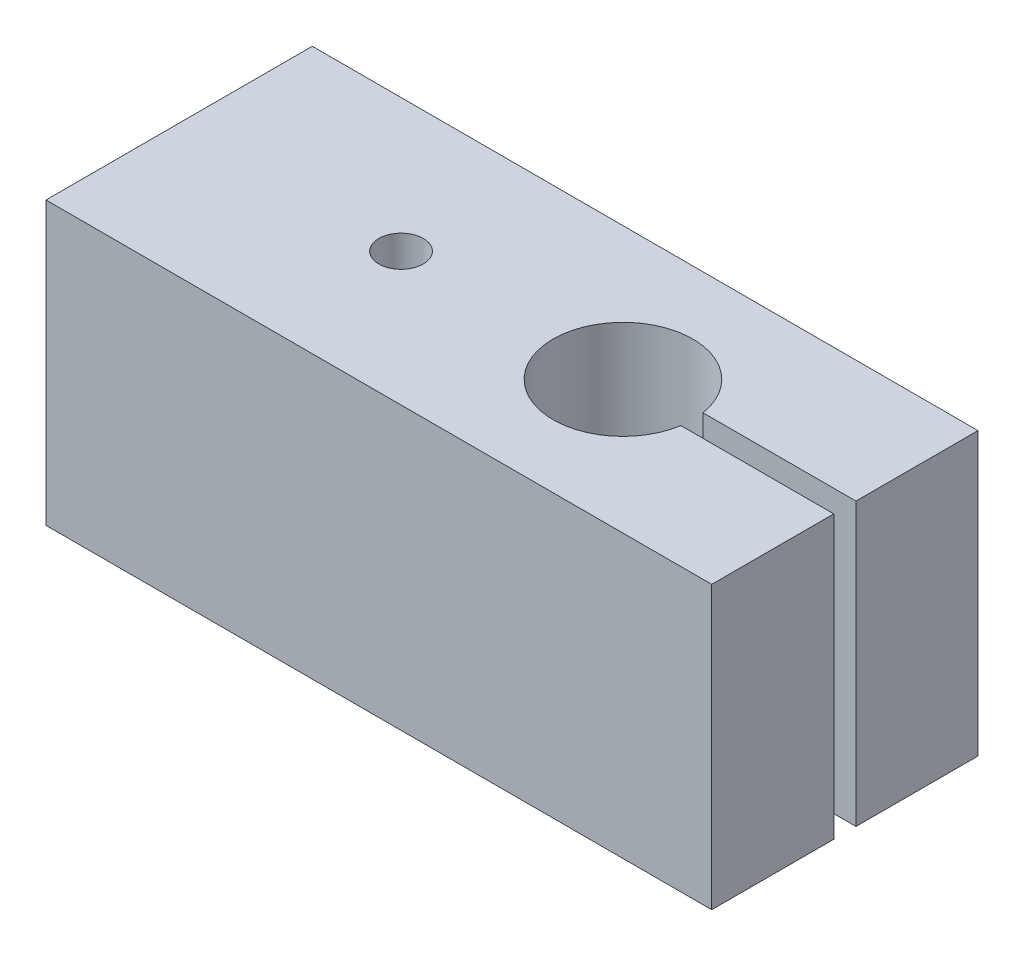
ISO-10303-21;
HEADER;
FILE_DESCRIPTION(('STEP AP214'),'2;1');
FILE_NAME('part.step','',(''),(''),'','','');
FILE_SCHEMA(('AUTOMOTIVE_DESIGN { 1 0 10303 214 1 1 1 1 }'));
ENDSEC;
DATA;
#1=APPLICATION_CONTEXT('core data for automotive mechanical design processes');
#2=APPLICATION_PROTOCOL_DEFINITION('international standard','automotive_design',2000,#1);
#3=PRODUCT_CONTEXT('',#1,'mechanical');
#4=PRODUCT('Part','Part','',(#3));
#5=PRODUCT_RELATED_PRODUCT_CATEGORY('part','',(#4));
#6=PRODUCT_DEFINITION_FORMATION('','',#4);
#7=PRODUCT_DEFINITION_CONTEXT('part definition',#1,'design');
#8=PRODUCT_DEFINITION('design','',#6,#7);
#9=PRODUCT_DEFINITION_SHAPE('','',#8);
#10=(LENGTH_UNIT() NAMED_UNIT(*) SI_UNIT(.MILLI.,.METRE.));
#11=(NAMED_UNIT(*) PLANE_ANGLE_UNIT() SI_UNIT($,.RADIAN.));
#12=(NAMED_UNIT(*) SI_UNIT($,.STERADIAN.) SOLID_ANGLE_UNIT());
#13=UNCERTAINTY_MEASURE_WITH_UNIT(LENGTH_MEASURE(1.E-05),#10,'distance_accuracy_value','');
#14=(GEOMETRIC_REPRESENTATION_CONTEXT(3) GLOBAL_UNCERTAINTY_ASSIGNED_CONTEXT((#13)) GLOBAL_UNIT_ASSIGNED_CONTEXT((#10,
#11,#12)) REPRESENTATION_CONTEXT('',''));
#15=CARTESIAN_POINT('',(0.,0.,0.));
#16=DIRECTION('',(0.,0.,1.));
#17=DIRECTION('',(1.,0.,0.));
#18=AXIS2_PLACEMENT_3D('',#15,#16,#17);
#19=CARTESIAN_POINT('',(10.,12.7,6.));
#20=DIRECTION('',(-1.,0.,0.));
#21=DIRECTION('',(0.,0.,1.));
#22=AXIS2_PLACEMENT_3D('',#19,#20,#21);
#23=PLANE('',#22);
#24=DIRECTION('',(0.,0.,-1.));
#25=VECTOR('',#24,1.);
#26=CARTESIAN_POINT('',(10.,0.,6.));
#27=LINE('',#26,#25);
#28=CARTESIAN_POINT('',(10.,0.,6.));
#29=VERTEX_POINT('',#28);
#30=CARTESIAN_POINT('',(10.,0.,0.5));
#31=VERTEX_POINT('',#30);
#32=EDGE_CURVE('E135',#29,#31,#27,.T.);
#33=ORIENTED_EDGE('',*,*,#32,.T.);
#34=DIRECTION('',(0.,1.,0.));
#35=VECTOR('',#34,1.);
#36=CARTESIAN_POINT('',(10.,0.,0.5));
#37=LINE('',#36,#35);
#38=CARTESIAN_POINT('',(10.,12.7,0.5));
#39=VERTEX_POINT('',#38);
#40=EDGE_CURVE('E224',#31,#39,#37,.T.);
#41=ORIENTED_EDGE('',*,*,#40,.T.);
#42=DIRECTION('',(0.,0.,-1.));
#43=VECTOR('',#42,1.);
#44=CARTESIAN_POINT('',(10.,12.7,6.));
#45=LINE('',#44,#43);
#46=CARTESIAN_POINT('',(10.,12.7,6.));
#47=VERTEX_POINT('',#46);
#48=EDGE_CURVE('E222',#47,#39,#45,.T.);
#49=ORIENTED_EDGE('',*,*,#48,.F.);
#50=DIRECTION('',(0.,-1.,0.));
#51=VECTOR('',#50,1.);
#52=CARTESIAN_POINT('',(10.,12.7,6.));
#53=LINE('',#52,#51);
#54=EDGE_CURVE('E157',#47,#29,#53,.T.);
#55=ORIENTED_EDGE('',*,*,#54,.T.);
#56=EDGE_LOOP('',(#33,#41,#49,#55));
#57=FACE_BOUND('',#56,.T.);
#58=ADVANCED_FACE('F36',(#57),#23,.F.);
#59=CARTESIAN_POINT('',(-10.,12.7,0.));
#60=DIRECTION('',(0.,-1.,0.));
#61=DIRECTION('',(0.,0.,-1.));
#62=AXIS2_PLACEMENT_3D('',#59,#60,#61);
#63=CYLINDRICAL_SURFACE('',#62,1.);
#64=CARTESIAN_POINT('',(-10.,12.7,0.));
#65=DIRECTION('',(0.,1.,0.));
#66=DIRECTION('',(0.,0.,1.));
#67=AXIS2_PLACEMENT_3D('',#64,#65,#66);
#68=CIRCLE('',#67,1.);
#69=CARTESIAN_POINT('',(-10.,12.7,1.));
#70=VERTEX_POINT('',#69);
#71=EDGE_CURVE('E340',#70,#70,#68,.T.);
#72=ORIENTED_EDGE('',*,*,#71,.T.);
#73=EDGE_LOOP('',(#72));
#74=FACE_BOUND('',#73,.T.);
#75=CARTESIAN_POINT('',(-10.,0.,0.));
#76=DIRECTION('',(0.,1.,0.));
#77=DIRECTION('',(0.,0.,1.));
#78=AXIS2_PLACEMENT_3D('',#75,#76,#77);
#79=CIRCLE('',#78,1.);
#80=CARTESIAN_POINT('',(-10.,0.,1.));
#81=VERTEX_POINT('',#80);
#82=EDGE_CURVE('E328',#81,#81,#79,.T.);
#83=ORIENTED_EDGE('',*,*,#82,.F.);
#84=EDGE_LOOP('',(#83));
#85=FACE_BOUND('',#84,.T.);
#86=CARTESIAN_POINT('',(-10.,10.2229833462074,-0.999999999999998));
#87=CARTESIAN_POINT('',(-10.0276629851065,10.2229814858018,-1.00000033749611));
#88=CARTESIAN_POINT('',(-10.0553122630182,10.2232800994947,-0.998851407375364));
#89=CARTESIAN_POINT('',(-10.1104040353036,10.2244590477456,-0.994271295395751));
#90=CARTESIAN_POINT('',(-10.1378465636871,10.2253392844169,-0.990840497572676));
#91=CARTESIAN_POINT('',(-10.2194531732088,10.2288171097205,-0.977175239382523));
#92=CARTESIAN_POINT('',(-10.2730564684822,10.2322520314881,-0.963567695172489));
#93=CARTESIAN_POINT('',(-10.377124673782,10.24095422588,-0.927798076247993));
#94=CARTESIAN_POINT('',(-10.4275898782129,10.2462213263093,-0.905636805423832));
#95=CARTESIAN_POINT('',(-10.5241114486473,10.2579913447194,-0.853415378025861));
#96=CARTESIAN_POINT('',(-10.570166627891,10.2644945939565,-0.823353103356928));
#97=CARTESIAN_POINT('',(-10.6575438819061,10.2781626239803,-0.755484471828065));
#98=CARTESIAN_POINT('',(-10.6987548862455,10.2853379102892,-0.717537268783972));
#99=CARTESIAN_POINT('',(-10.7743020894827,10.2994510439619,-0.635275780516226));
#100=CARTESIAN_POINT('',(-10.8086371894679,10.3063888532254,-0.590960479478827));
#101=CARTESIAN_POINT('',(-10.8699110016186,10.3193618228325,-0.496456899401685));
#102=CARTESIAN_POINT('',(-10.896739895984,10.3253830468173,-0.446195340334468));
#103=CARTESIAN_POINT('',(-10.9415247341967,10.3357234625059,-0.341702590842913));
#104=CARTESIAN_POINT('',(-10.9594824242998,10.340042989147,-0.287472184083004));
#105=CARTESIAN_POINT('',(-10.9856589927774,10.3464190000513,-0.177744108525154));
#106=CARTESIAN_POINT('',(-10.9940676724228,10.348519529013,-0.122294322002852));
#107=CARTESIAN_POINT('',(-11.0015033715433,10.3503743815082,-0.0107327756816735));
#108=CARTESIAN_POINT('',(-11.0005315701923,10.3501289999344,0.0453789000287115));
#109=CARTESIAN_POINT('',(-10.9893700363145,10.3473523736574,0.155352492972102));
#110=CARTESIAN_POINT('',(-10.9793853834005,10.3448719867736,0.209236701739861));
#111=CARTESIAN_POINT('',(-10.9508113208172,10.337963306365,0.314538711084346));
#112=CARTESIAN_POINT('',(-10.9322215304314,10.3335349266556,0.365956402423993));
#113=CARTESIAN_POINT('',(-10.8867987193293,10.323149977618,0.465407286024544));
#114=CARTESIAN_POINT('',(-10.8598926057672,10.3171799382756,0.513405629602253));
#115=CARTESIAN_POINT('',(-10.7986568701665,10.3043594554192,0.604276631230019));
#116=CARTESIAN_POINT('',(-10.7643261297468,10.297508879332,0.647148515562294));
#117=CARTESIAN_POINT('',(-10.6881210879187,10.2834556602287,0.727769389708495));
#118=CARTESIAN_POINT('',(-10.6460683634602,10.2762485047769,0.765349103054131));
#119=CARTESIAN_POINT('',(-10.5561701330723,10.2624616828401,0.832969575186241));
#120=CARTESIAN_POINT('',(-10.5083230467164,10.2558821884299,0.863008270245065));
#121=CARTESIAN_POINT('',(-10.4078544021762,10.2440781358633,0.914804709285964));
#122=CARTESIAN_POINT('',(-10.3552085351039,10.2388610600914,0.936517017887272));
#123=CARTESIAN_POINT('',(-10.2468830715817,10.2304705880706,0.970702351849831));
#124=CARTESIAN_POINT('',(-10.1912081448502,10.2272941376144,0.983189189212133));
#125=CARTESIAN_POINT('',(-10.1125426192411,10.2245529068152,0.993904635150939));
#126=CARTESIAN_POINT('',(-10.0900802967868,10.2239652311086,0.996190790966709));
#127=CARTESIAN_POINT('',(-10.0450822100907,10.2231806248897,0.999236757697394));
#128=CARTESIAN_POINT('',(-10.0225466240447,10.2229830621946,0.999999038096046));
#129=CARTESIAN_POINT('',(-10.,10.2229833462074,1.));
#130=B_SPLINE_CURVE_WITH_KNOTS('',3,(#86,#87,#88,#89,#90,#91,#92,#93,#94,#95,#96,#97,#98,#99,
#100,#101,#102,#103,#104,#105,#106,#107,#108,#109,#110,#111,#112,#113,#114,#115,#116,#117,#118,
#119,#120,#121,#122,#123,#124,#125,#126,#127,#128,#129),.UNSPECIFIED.,.F.,.F.,(4,2,2,2,2,2,2,2,
2,2,2,2,2,2,2,2,2,2,2,2,2,4),(0.,0.082936530339771,0.165859106084651,0.331229963080316,
0.496585282091498,0.661984974726747,0.830641897427971,0.99932575353919,1.17036187098235,
1.34136430732424,1.50890481515325,1.67642426256639,1.84022545479275,2.00403389475838,
2.16932509450376,2.33464120964329,2.50441429534542,2.67423379180967,2.84496720161067,
3.01544447539985,3.08315848722647,3.1507626773167),.UNSPECIFIED.);
#131=CARTESIAN_POINT('',(-10.,10.2229833462074,-0.999999999999998));
#132=VERTEX_POINT('',#131);
#133=CARTESIAN_POINT('',(-10.,10.2229833462074,1.));
#134=VERTEX_POINT('',#133);
#135=EDGE_CURVE('E163',#132,#134,#130,.T.);
#136=ORIENTED_EDGE('',*,*,#135,.F.);
#137=DIRECTION('',(0.,-1.,0.));
#138=VECTOR('',#137,1.);
#139=CARTESIAN_POINT('',(-10.,12.7,-0.999999999999998));
#140=LINE('',#139,#138);
#141=CARTESIAN_POINT('',(-10.,2.47701665379259,-0.999999999999998));
#142=VERTEX_POINT('',#141);
#143=EDGE_CURVE('E11',#132,#142,#140,.T.);
#144=ORIENTED_EDGE('',*,*,#143,.T.);
#145=CARTESIAN_POINT('',(-10.,2.47701665379258,1.));
#146=CARTESIAN_POINT('',(-10.0276629851065,2.47701851419822,1.00000033749611));
#147=CARTESIAN_POINT('',(-10.0553122630182,2.47671990050529,0.998851407375367));
#148=CARTESIAN_POINT('',(-10.1104040353036,2.47554095225441,0.994271295395755));
#149=CARTESIAN_POINT('',(-10.1378465636871,2.47466071558313,0.990840497572679));
#150=CARTESIAN_POINT('',(-10.2194531732088,2.47118289027946,0.977175239382526));
#151=CARTESIAN_POINT('',(-10.2730564684822,2.46774796851191,0.963567695172493));
#152=CARTESIAN_POINT('',(-10.377124673782,2.45904577411997,0.927798076247996));
#153=CARTESIAN_POINT('',(-10.4275898782129,2.4537786736907,0.905636805423835));
#154=CARTESIAN_POINT('',(-10.5241114486473,2.4420086552806,0.853415378025865));
#155=CARTESIAN_POINT('',(-10.570166627891,2.43550540604353,0.823353103356932));
#156=CARTESIAN_POINT('',(-10.6575438819061,2.42183737601974,0.755484471828067));
#157=CARTESIAN_POINT('',(-10.6987548862455,2.41466208971084,0.717537268783974));
#158=CARTESIAN_POINT('',(-10.7743020894827,2.40054895603806,0.635275780516227));
#159=CARTESIAN_POINT('',(-10.8086371894679,2.39361114677463,0.590960479478828));
#160=CARTESIAN_POINT('',(-10.8699110016186,2.38063817716751,0.496456899401687));
#161=CARTESIAN_POINT('',(-10.896739895984,2.37461695318269,0.44619534033447));
#162=CARTESIAN_POINT('',(-10.9415247341967,2.36427653749411,0.341702590842916));
#163=CARTESIAN_POINT('',(-10.9594824242998,2.35995701085299,0.287472184083006));
#164=CARTESIAN_POINT('',(-10.9856589927774,2.35358099994872,0.177744108525157));
#165=CARTESIAN_POINT('',(-10.9940676724228,2.35148047098699,0.122294322002855));
#166=CARTESIAN_POINT('',(-11.0015033715433,2.34962561849184,0.0107327756816766));
#167=CARTESIAN_POINT('',(-11.0005315701923,2.34987100006555,-0.0453789000287084));
#168=CARTESIAN_POINT('',(-10.9893700363145,2.35264762634264,-0.155352492972099));
#169=CARTESIAN_POINT('',(-10.9793853834005,2.35512801322639,-0.209236701739857));
#170=CARTESIAN_POINT('',(-10.9508113208172,2.36203669363504,-0.314538711084342));
#171=CARTESIAN_POINT('',(-10.9322215304314,2.36646507334444,-0.36595640242399));
#172=CARTESIAN_POINT('',(-10.8867987193293,2.37685002238202,-0.465407286024541));
#173=CARTESIAN_POINT('',(-10.8598926057672,2.38282006172445,-0.51340562960225));
#174=CARTESIAN_POINT('',(-10.7986568701665,2.39564054458081,-0.604276631230016));
#175=CARTESIAN_POINT('',(-10.7643261297468,2.40249112066802,-0.64714851556229));
#176=CARTESIAN_POINT('',(-10.6881210879187,2.41654433977135,-0.727769389708492));
#177=CARTESIAN_POINT('',(-10.6460683634602,2.42375149522315,-0.765349103054128));
#178=CARTESIAN_POINT('',(-10.5561701330723,2.43753831715994,-0.832969575186238));
#179=CARTESIAN_POINT('',(-10.5083230467164,2.44411781157007,-0.863008270245062));
#180=CARTESIAN_POINT('',(-10.4078544021762,2.45592186413675,-0.914804709285961));
#181=CARTESIAN_POINT('',(-10.3552085351039,2.46113893990864,-0.936517017887268));
#182=CARTESIAN_POINT('',(-10.2468830715817,2.46952941192945,-0.970702351849827));
#183=CARTESIAN_POINT('',(-10.1912081448502,2.47270586238565,-0.98318918921213));
#184=CARTESIAN_POINT('',(-10.1125426192411,2.47544709318476,-0.993904635150935));
#185=CARTESIAN_POINT('',(-10.0900802967868,2.47603476889141,-0.996190790966706));
#186=CARTESIAN_POINT('',(-10.0450822100907,2.47681937511026,-0.999236757697391));
#187=CARTESIAN_POINT('',(-10.0225466240447,2.47701693780539,-0.999999038096043));
#188=CARTESIAN_POINT('',(-10.,2.47701665379259,-0.999999999999998));
#189=B_SPLINE_CURVE_WITH_KNOTS('',3,(#145,#146,#147,#148,#149,#150,#151,#152,#153,#154,#155,
#156,#157,#158,#159,#160,#161,#162,#163,#164,#165,#166,#167,#168,#169,#170,#171,#172,#173,#174,
#175,#176,#177,#178,#179,#180,#181,#182,#183,#184,#185,#186,#187,#188),.UNSPECIFIED.,.F.,.F.,(4,
2,2,2,2,2,2,2,2,2,2,2,2,2,2,2,2,2,2,2,2,4),(0.,0.082936530339771,0.165859106084653,
0.331229963080316,0.496585282091498,0.661984974726747,0.830641897427974,0.999325753539193,
1.17036187098235,1.34136430732424,1.50890481515325,1.67642426256639,1.84022545479275,
2.00403389475838,2.16932509450376,2.33464120964329,2.50441429534542,2.67423379180967,
2.84496720161067,3.01544447539985,3.08315848722647,3.1507626773167),.UNSPECIFIED.);
#190=CARTESIAN_POINT('',(-10.,2.47701665379258,1.));
#191=VERTEX_POINT('',#190);
#192=EDGE_CURVE('E44',#191,#142,#189,.T.);
#193=ORIENTED_EDGE('',*,*,#192,.F.);
#194=DIRECTION('',(0.,-1.,0.));
#195=VECTOR('',#194,1.);
#196=CARTESIAN_POINT('',(-10.,12.7,1.));
#197=LINE('',#196,#195);
#198=EDGE_CURVE('E160',#191,#134,#197,.F.);
#199=ORIENTED_EDGE('',*,*,#198,.T.);
#200=EDGE_LOOP('',(#136,#144,#193,#199));
#201=FACE_BOUND('',#200,.T.);
#202=ADVANCED_FACE('F175',(#74,#85,#201),#63,.F.);
#203=CARTESIAN_POINT('',(0.,12.7,0.));
#204=DIRECTION('',(0.,1.,0.));
#205=DIRECTION('',(0.,0.,1.));
#206=AXIS2_PLACEMENT_3D('',#203,#204,#205);
#207=PLANE('',#206);
#208=DIRECTION('',(1.,0.,0.));
#209=VECTOR('',#208,1.);
#210=CARTESIAN_POINT('',(10.,12.7,0.5));
#211=LINE('',#210,#209);
#212=CARTESIAN_POINT('',(3.1100643080168,12.7,0.500000000000001));
#213=VERTEX_POINT('',#212);
#214=EDGE_CURVE('E120',#213,#39,#211,.T.);
#215=ORIENTED_EDGE('',*,*,#214,.F.);
#216=CARTESIAN_POINT('',(0.,12.7,0.));
#217=DIRECTION('',(0.,1.,0.));
#218=DIRECTION('',(0.,0.,1.));
#219=AXIS2_PLACEMENT_3D('',#216,#217,#218);
#220=CIRCLE('',#219,3.15);
#221=CARTESIAN_POINT('',(3.1100643080168,12.7,-0.500000000000003));
#222=VERTEX_POINT('',#221);
#223=EDGE_CURVE('E140',#222,#213,#220,.T.);
#224=ORIENTED_EDGE('',*,*,#223,.F.);
#225=DIRECTION('',(-1.,0.,0.));
#226=VECTOR('',#225,1.);
#227=CARTESIAN_POINT('',(10.,12.7,-0.5));
#228=LINE('',#227,#226);
#229=CARTESIAN_POINT('',(10.,12.7,-0.5));
#230=VERTEX_POINT('',#229);
#231=EDGE_CURVE('E59',#230,#222,#228,.T.);
#232=ORIENTED_EDGE('',*,*,#231,.F.);
#233=CARTESIAN_POINT('',(10.,12.7,-6.00000000000001));
#234=VERTEX_POINT('',#233);
#235=EDGE_CURVE('E128',#230,#234,#45,.T.);
#236=ORIENTED_EDGE('',*,*,#235,.T.);
#237=DIRECTION('',(-1.,0.,0.));
#238=VECTOR('',#237,1.);
#239=CARTESIAN_POINT('',(10.,12.7,-6.00000000000001));
#240=LINE('',#239,#238);
#241=CARTESIAN_POINT('',(-20.,12.7,-6.));
#242=VERTEX_POINT('',#241);
#243=EDGE_CURVE('E227',#234,#242,#240,.T.);
#244=ORIENTED_EDGE('',*,*,#243,.T.);
#245=DIRECTION('',(0.,0.,1.));
#246=VECTOR('',#245,1.);
#247=CARTESIAN_POINT('',(-20.,12.7,-6.));
#248=LINE('',#247,#246);
#249=CARTESIAN_POINT('',(-20.,12.7,6.));
#250=VERTEX_POINT('',#249);
#251=EDGE_CURVE('E152',#242,#250,#248,.T.);
#252=ORIENTED_EDGE('',*,*,#251,.T.);
#253=DIRECTION('',(1.,0.,0.));
#254=VECTOR('',#253,1.);
#255=CARTESIAN_POINT('',(-20.,12.7,6.));
#256=LINE('',#255,#254);
#257=EDGE_CURVE('E147',#250,#47,#256,.T.);
#258=ORIENTED_EDGE('',*,*,#257,.T.);
#259=ORIENTED_EDGE('',*,*,#48,.T.);
#260=EDGE_LOOP('',(#215,#224,#232,#236,#244,#252,#258,#259));
#261=FACE_BOUND('',#260,.T.);
#262=ORIENTED_EDGE('',*,*,#71,.F.);
#263=EDGE_LOOP('',(#262));
#264=FACE_BOUND('',#263,.T.);
#265=ADVANCED_FACE('F200',(#261,#264),#207,.T.);
#266=CARTESIAN_POINT('',(0.,0.,0.));
#267=DIRECTION('',(0.,1.,0.));
#268=DIRECTION('',(0.,0.,1.));
#269=AXIS2_PLACEMENT_3D('',#266,#267,#268);
#270=PLANE('',#269);
#271=CARTESIAN_POINT('',(0.,0.,0.));
#272=DIRECTION('',(0.,1.,0.));
#273=DIRECTION('',(0.,0.,1.));
#274=AXIS2_PLACEMENT_3D('',#271,#272,#273);
#275=CIRCLE('',#274,3.15);
#276=CARTESIAN_POINT('',(3.1100643080168,0.,-0.500000000000001));
#277=VERTEX_POINT('',#276);
#278=CARTESIAN_POINT('',(3.1100643080168,0.,0.500000000000001));
#279=VERTEX_POINT('',#278);
#280=EDGE_CURVE('E233',#277,#279,#275,.T.);
#281=ORIENTED_EDGE('',*,*,#280,.T.);
#282=DIRECTION('',(1.,0.,0.));
#283=VECTOR('',#282,1.);
#284=CARTESIAN_POINT('',(10.,0.,0.5));
#285=LINE('',#284,#283);
#286=EDGE_CURVE('E51',#279,#31,#285,.T.);
#287=ORIENTED_EDGE('',*,*,#286,.T.);
#288=ORIENTED_EDGE('',*,*,#32,.F.);
#289=DIRECTION('',(1.,0.,0.));
#290=VECTOR('',#289,1.);
#291=CARTESIAN_POINT('',(-20.,0.,6.));
#292=LINE('',#291,#290);
#293=CARTESIAN_POINT('',(-20.,0.,6.));
#294=VERTEX_POINT('',#293);
#295=EDGE_CURVE('E136',#294,#29,#292,.T.);
#296=ORIENTED_EDGE('',*,*,#295,.F.);
#297=DIRECTION('',(0.,0.,1.));
#298=VECTOR('',#297,1.);
#299=CARTESIAN_POINT('',(-20.,0.,-6.));
#300=LINE('',#299,#298);
#301=CARTESIAN_POINT('',(-20.,0.,-6.));
#302=VERTEX_POINT('',#301);
#303=EDGE_CURVE('E145',#302,#294,#300,.T.);
#304=ORIENTED_EDGE('',*,*,#303,.F.);
#305=DIRECTION('',(-1.,0.,0.));
#306=VECTOR('',#305,1.);
#307=CARTESIAN_POINT('',(10.,0.,-6.00000000000001));
#308=LINE('',#307,#306);
#309=CARTESIAN_POINT('',(10.,0.,-6.00000000000001));
#310=VERTEX_POINT('',#309);
#311=EDGE_CURVE('E134',#310,#302,#308,.T.);
#312=ORIENTED_EDGE('',*,*,#311,.F.);
#313=CARTESIAN_POINT('',(10.,0.,-0.5));
#314=VERTEX_POINT('',#313);
#315=EDGE_CURVE('E126',#314,#310,#27,.T.);
#316=ORIENTED_EDGE('',*,*,#315,.F.);
#317=DIRECTION('',(-1.,0.,0.));
#318=VECTOR('',#317,1.);
#319=CARTESIAN_POINT('',(10.,0.,-0.5));
#320=LINE('',#319,#318);
#321=EDGE_CURVE('E111',#314,#277,#320,.T.);
#322=ORIENTED_EDGE('',*,*,#321,.T.);
#323=EDGE_LOOP('',(#281,#287,#288,#296,#304,#312,#316,#322));
#324=FACE_BOUND('',#323,.T.);
#325=ORIENTED_EDGE('',*,*,#82,.T.);
#326=EDGE_LOOP('',(#325));
#327=FACE_BOUND('',#326,.T.);
#328=ADVANCED_FACE('F131',(#324,#327),#270,.F.);
#329=CARTESIAN_POINT('',(-20.,12.7,6.));
#330=DIRECTION('',(0.,0.,-1.));
#331=DIRECTION('',(-1.,0.,0.));
#332=AXIS2_PLACEMENT_3D('',#329,#330,#331);
#333=PLANE('',#332);
#334=ORIENTED_EDGE('',*,*,#295,.T.);
#335=ORIENTED_EDGE('',*,*,#54,.F.);
#336=ORIENTED_EDGE('',*,*,#257,.F.);
#337=DIRECTION('',(0.,-1.,0.));
#338=VECTOR('',#337,1.);
#339=CARTESIAN_POINT('',(-20.,12.7,6.));
#340=LINE('',#339,#338);
#341=EDGE_CURVE('E148',#250,#294,#340,.T.);
#342=ORIENTED_EDGE('',*,*,#341,.T.);
#343=EDGE_LOOP('',(#334,#335,#336,#342));
#344=FACE_BOUND('',#343,.T.);
#345=ADVANCED_FACE('F38',(#344),#333,.F.);
#346=ORIENTED_EDGE('',*,*,#235,.F.);
#347=DIRECTION('',(0.,1.,0.));
#348=VECTOR('',#347,1.);
#349=CARTESIAN_POINT('',(10.,0.,-0.5));
#350=LINE('',#349,#348);
#351=EDGE_CURVE('E114',#314,#230,#350,.T.);
#352=ORIENTED_EDGE('',*,*,#351,.F.);
#353=ORIENTED_EDGE('',*,*,#315,.T.);
#354=DIRECTION('',(0.,-1.,0.));
#355=VECTOR('',#354,1.);
#356=CARTESIAN_POINT('',(10.,12.7,-6.00000000000001));
#357=LINE('',#356,#355);
#358=EDGE_CURVE('E155',#234,#310,#357,.T.);
#359=ORIENTED_EDGE('',*,*,#358,.F.);
#360=EDGE_LOOP('',(#346,#352,#353,#359));
#361=FACE_BOUND('',#360,.T.);
#362=ADVANCED_FACE('F124',(#361),#23,.F.);
#363=CARTESIAN_POINT('',(10.,12.7,-6.00000000000001));
#364=DIRECTION('',(0.,0.,1.));
#365=DIRECTION('',(1.,0.,0.));
#366=AXIS2_PLACEMENT_3D('',#363,#364,#365);
#367=PLANE('',#366);
#368=ORIENTED_EDGE('',*,*,#311,.T.);
#369=DIRECTION('',(0.,-1.,0.));
#370=VECTOR('',#369,1.);
#371=CARTESIAN_POINT('',(-20.,12.7,-6.));
#372=LINE('',#371,#370);
#373=EDGE_CURVE('E151',#242,#302,#372,.T.);
#374=ORIENTED_EDGE('',*,*,#373,.F.);
#375=ORIENTED_EDGE('',*,*,#243,.F.);
#376=ORIENTED_EDGE('',*,*,#358,.T.);
#377=EDGE_LOOP('',(#368,#374,#375,#376));
#378=FACE_BOUND('',#377,.T.);
#379=ADVANCED_FACE('F204',(#378),#367,.F.);
#380=CARTESIAN_POINT('',(-20.,12.7,-6.));
#381=DIRECTION('',(1.,0.,0.));
#382=DIRECTION('',(0.,0.,-1.));
#383=AXIS2_PLACEMENT_3D('',#380,#381,#382);
#384=PLANE('',#383);
#385=CARTESIAN_POINT('',(-20.,6.35,0.));
#386=DIRECTION('',(-1.,0.,0.));
#387=DIRECTION('',(0.,0.,1.));
#388=AXIS2_PLACEMENT_3D('',#385,#386,#387);
#389=CIRCLE('',#388,4.);
#390=CARTESIAN_POINT('',(-20.,6.35,4.00000000000001));
#391=VERTEX_POINT('',#390);
#392=EDGE_CURVE('E335',#391,#391,#389,.T.);
#393=ORIENTED_EDGE('',*,*,#392,.F.);
#394=EDGE_LOOP('',(#393));
#395=FACE_BOUND('',#394,.T.);
#396=ORIENTED_EDGE('',*,*,#303,.T.);
#397=ORIENTED_EDGE('',*,*,#341,.F.);
#398=ORIENTED_EDGE('',*,*,#251,.F.);
#399=ORIENTED_EDGE('',*,*,#373,.T.);
#400=EDGE_LOOP('',(#396,#397,#398,#399));
#401=FACE_BOUND('',#400,.T.);
#402=ADVANCED_FACE('F209',(#395,#401),#384,.F.);
#403=CARTESIAN_POINT('',(0.,12.7,0.));
#404=DIRECTION('',(0.,-1.,0.));
#405=DIRECTION('',(0.,0.,-1.));
#406=AXIS2_PLACEMENT_3D('',#403,#404,#405);
#407=CYLINDRICAL_SURFACE('',#406,3.15);
#408=DIRECTION('',(0.,1.,0.));
#409=VECTOR('',#408,1.);
#410=CARTESIAN_POINT('',(3.1100643080168,0.,0.500000000000001));
#411=LINE('',#410,#409);
#412=EDGE_CURVE('E346',#279,#213,#411,.T.);
#413=ORIENTED_EDGE('',*,*,#412,.F.);
#414=ORIENTED_EDGE('',*,*,#280,.F.);
#415=DIRECTION('',(0.,1.,0.));
#416=VECTOR('',#415,1.);
#417=CARTESIAN_POINT('',(3.1100643080168,0.,-0.500000000000001));
#418=LINE('',#417,#416);
#419=EDGE_CURVE('E115',#277,#222,#418,.T.);
#420=ORIENTED_EDGE('',*,*,#419,.T.);
#421=ORIENTED_EDGE('',*,*,#223,.T.);
#422=EDGE_LOOP('',(#413,#414,#420,#421));
#423=FACE_BOUND('',#422,.T.);
#424=ADVANCED_FACE('F240',(#423),#407,.F.);
#425=CARTESIAN_POINT('',(-10.,6.35,0.));
#426=DIRECTION('',(-1.,0.,0.));
#427=DIRECTION('',(0.,0.,1.));
#428=AXIS2_PLACEMENT_3D('',#425,#426,#427);
#429=PLANE('',#428);
#430=CARTESIAN_POINT('',(-10.,6.35,0.));
#431=DIRECTION('',(-1.,0.,0.));
#432=DIRECTION('',(0.,0.,1.));
#433=AXIS2_PLACEMENT_3D('',#430,#431,#432);
#434=CIRCLE('',#433,4.);
#435=EDGE_CURVE('E326',#132,#142,#434,.T.);
#436=ORIENTED_EDGE('',*,*,#435,.T.);
#437=ORIENTED_EDGE('',*,*,#143,.F.);
#438=EDGE_LOOP('',(#436,#437));
#439=FACE_BOUND('',#438,.T.);
#440=ADVANCED_FACE('F183',(#439),#429,.T.);
#441=CARTESIAN_POINT('',(-10.,6.35,0.));
#442=DIRECTION('',(-1.,0.,0.));
#443=DIRECTION('',(0.,0.,1.));
#444=AXIS2_PLACEMENT_3D('',#441,#442,#443);
#445=CYLINDRICAL_SURFACE('',#444,4.);
#446=ORIENTED_EDGE('',*,*,#192,.T.);
#447=ORIENTED_EDGE('',*,*,#435,.F.);
#448=ORIENTED_EDGE('',*,*,#135,.T.);
#449=EDGE_CURVE('E329',#191,#134,#434,.T.);
#450=ORIENTED_EDGE('',*,*,#449,.F.);
#451=EDGE_LOOP('',(#446,#447,#448,#450));
#452=FACE_BOUND('',#451,.T.);
#453=ORIENTED_EDGE('',*,*,#392,.T.);
#454=EDGE_LOOP('',(#453));
#455=FACE_BOUND('',#454,.T.);
#456=ADVANCED_FACE('F178',(#452,#455),#445,.F.);
#457=ORIENTED_EDGE('',*,*,#449,.T.);
#458=ORIENTED_EDGE('',*,*,#198,.F.);
#459=EDGE_LOOP('',(#457,#458));
#460=FACE_BOUND('',#459,.T.);
#461=ADVANCED_FACE('F182',(#460),#429,.T.);
#462=CARTESIAN_POINT('',(10.,0.,-0.5));
#463=DIRECTION('',(0.,0.,-1.));
#464=DIRECTION('',(-1.,0.,0.));
#465=AXIS2_PLACEMENT_3D('',#462,#463,#464);
#466=PLANE('',#465);
#467=ORIENTED_EDGE('',*,*,#231,.T.);
#468=ORIENTED_EDGE('',*,*,#419,.F.);
#469=ORIENTED_EDGE('',*,*,#321,.F.);
#470=ORIENTED_EDGE('',*,*,#351,.T.);
#471=EDGE_LOOP('',(#467,#468,#469,#470));
#472=FACE_BOUND('',#471,.T.);
#473=ADVANCED_FACE('F113',(#472),#466,.F.);
#474=CARTESIAN_POINT('',(10.,0.,0.5));
#475=DIRECTION('',(0.,0.,1.));
#476=DIRECTION('',(1.,0.,0.));
#477=AXIS2_PLACEMENT_3D('',#474,#475,#476);
#478=PLANE('',#477);
#479=ORIENTED_EDGE('',*,*,#214,.T.);
#480=ORIENTED_EDGE('',*,*,#40,.F.);
#481=ORIENTED_EDGE('',*,*,#286,.F.);
#482=ORIENTED_EDGE('',*,*,#412,.T.);
#483=EDGE_LOOP('',(#479,#480,#481,#482));
#484=FACE_BOUND('',#483,.T.);
#485=ADVANCED_FACE('F191',(#484),#478,.F.);
#486=CLOSED_SHELL('',(#58,#202,#265,#328,#345,#362,#379,#402,#424,#440,#456,#461,#473,#485));
#487=MANIFOLD_SOLID_BREP('B2',#486);
#488=ADVANCED_BREP_SHAPE_REPRESENTATION('',(#18,#487),#14);
#489=SHAPE_DEFINITION_REPRESENTATION(#9,#488);
ENDSEC;
END-ISO-10303-21;
